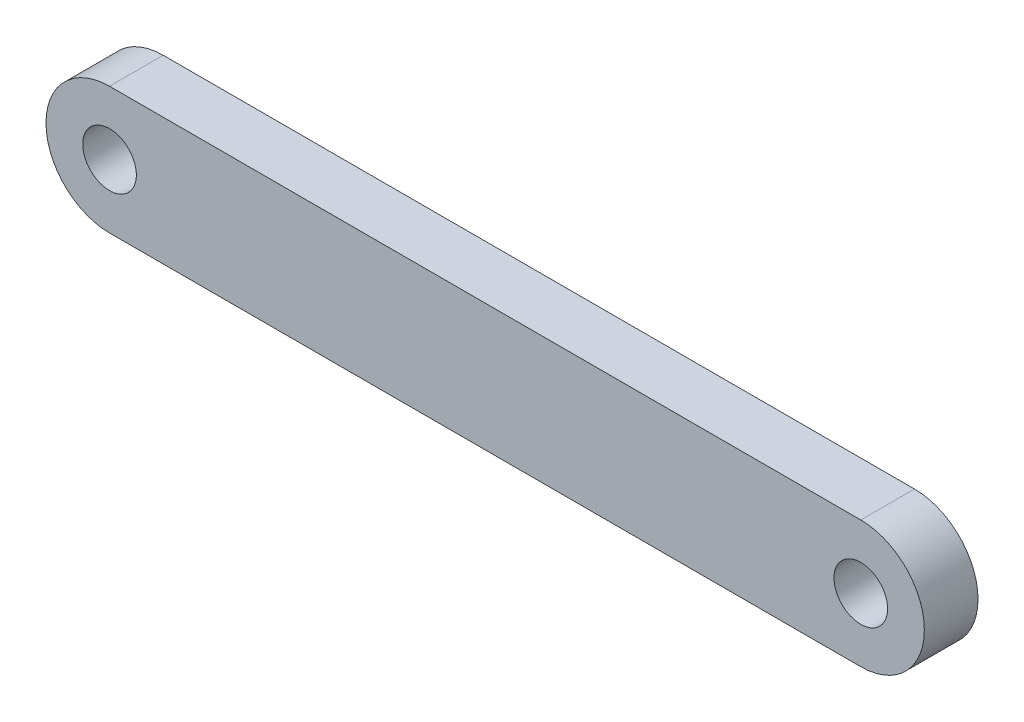
ISO-10303-21;
HEADER;
FILE_DESCRIPTION(('STEP AP214'),'2;1');
FILE_NAME('part.step','',(''),(''),'','','');
FILE_SCHEMA(('AUTOMOTIVE_DESIGN { 1 0 10303 214 1 1 1 1 }'));
ENDSEC;
DATA;
#1=APPLICATION_CONTEXT('core data for automotive mechanical design processes');
#2=APPLICATION_PROTOCOL_DEFINITION('international standard','automotive_design',2000,#1);
#3=PRODUCT_CONTEXT('',#1,'mechanical');
#4=PRODUCT('Part','Part','',(#3));
#5=PRODUCT_RELATED_PRODUCT_CATEGORY('part','',(#4));
#6=PRODUCT_DEFINITION_FORMATION('','',#4);
#7=PRODUCT_DEFINITION_CONTEXT('part definition',#1,'design');
#8=PRODUCT_DEFINITION('design','',#6,#7);
#9=PRODUCT_DEFINITION_SHAPE('','',#8);
#10=(LENGTH_UNIT() NAMED_UNIT(*) SI_UNIT(.MILLI.,.METRE.));
#11=(NAMED_UNIT(*) PLANE_ANGLE_UNIT() SI_UNIT($,.RADIAN.));
#12=(NAMED_UNIT(*) SI_UNIT($,.STERADIAN.) SOLID_ANGLE_UNIT());
#13=UNCERTAINTY_MEASURE_WITH_UNIT(LENGTH_MEASURE(1.E-05),#10,'distance_accuracy_value','');
#14=(GEOMETRIC_REPRESENTATION_CONTEXT(3) GLOBAL_UNCERTAINTY_ASSIGNED_CONTEXT((#13)) GLOBAL_UNIT_ASSIGNED_CONTEXT((#10,
#11,#12)) REPRESENTATION_CONTEXT('',''));
#15=CARTESIAN_POINT('',(0.,0.,0.));
#16=DIRECTION('',(0.,0.,1.));
#17=DIRECTION('',(1.,0.,0.));
#18=AXIS2_PLACEMENT_3D('',#15,#16,#17);
#19=CARTESIAN_POINT('',(-13.8947368421053,0.,2.));
#20=DIRECTION('',(0.,0.,1.));
#21=DIRECTION('',(1.,0.,0.));
#22=AXIS2_PLACEMENT_3D('',#19,#20,#21);
#23=PLANE('',#22);
#24=CARTESIAN_POINT('',(14.1052631578947,0.,2.));
#25=DIRECTION('',(0.,0.,1.));
#26=DIRECTION('',(1.,0.,0.));
#27=AXIS2_PLACEMENT_3D('',#24,#25,#26);
#28=CIRCLE('',#27,1.);
#29=CARTESIAN_POINT('',(15.1052631578947,0.,2.));
#30=VERTEX_POINT('',#29);
#31=EDGE_CURVE('E100',#30,#30,#28,.T.);
#32=ORIENTED_EDGE('',*,*,#31,.F.);
#33=EDGE_LOOP('',(#32));
#34=FACE_BOUND('',#33,.T.);
#35=CARTESIAN_POINT('',(-13.8947368421053,0.,2.));
#36=DIRECTION('',(0.,0.,1.));
#37=DIRECTION('',(1.,0.,0.));
#38=AXIS2_PLACEMENT_3D('',#35,#36,#37);
#39=CIRCLE('',#38,2.36842105263158);
#40=CARTESIAN_POINT('',(-13.8947368421053,2.36842105263158,2.));
#41=VERTEX_POINT('',#40);
#42=CARTESIAN_POINT('',(-13.8947368421053,-2.36842105263158,2.));
#43=VERTEX_POINT('',#42);
#44=EDGE_CURVE('E85',#41,#43,#39,.T.);
#45=ORIENTED_EDGE('',*,*,#44,.T.);
#46=DIRECTION('',(1.,0.,0.));
#47=VECTOR('',#46,1.);
#48=CARTESIAN_POINT('',(-13.8947368421053,-2.36842105263158,2.));
#49=LINE('',#48,#47);
#50=CARTESIAN_POINT('',(14.1052631578947,-2.36842105263158,2.));
#51=VERTEX_POINT('',#50);
#52=EDGE_CURVE('E80',#43,#51,#49,.T.);
#53=ORIENTED_EDGE('',*,*,#52,.T.);
#54=CARTESIAN_POINT('',(14.1052631578947,0.,2.));
#55=DIRECTION('',(0.,0.,1.));
#56=DIRECTION('',(1.,0.,0.));
#57=AXIS2_PLACEMENT_3D('',#54,#55,#56);
#58=CIRCLE('',#57,2.36842105263158);
#59=CARTESIAN_POINT('',(14.1052631578947,2.36842105263158,2.));
#60=VERTEX_POINT('',#59);
#61=EDGE_CURVE('E83',#51,#60,#58,.T.);
#62=ORIENTED_EDGE('',*,*,#61,.T.);
#63=DIRECTION('',(-1.,0.,0.));
#64=VECTOR('',#63,1.);
#65=CARTESIAN_POINT('',(-13.8947368421053,2.36842105263158,2.));
#66=LINE('',#65,#64);
#67=EDGE_CURVE('E50',#60,#41,#66,.T.);
#68=ORIENTED_EDGE('',*,*,#67,.T.);
#69=EDGE_LOOP('',(#45,#53,#62,#68));
#70=FACE_BOUND('',#69,.T.);
#71=CARTESIAN_POINT('',(-13.8947368421053,0.,2.));
#72=DIRECTION('',(0.,0.,1.));
#73=DIRECTION('',(1.,0.,0.));
#74=AXIS2_PLACEMENT_3D('',#71,#72,#73);
#75=CIRCLE('',#74,1.);
#76=CARTESIAN_POINT('',(-12.8947368421053,0.,2.));
#77=VERTEX_POINT('',#76);
#78=EDGE_CURVE('E115',#77,#77,#75,.T.);
#79=ORIENTED_EDGE('',*,*,#78,.F.);
#80=EDGE_LOOP('',(#79));
#81=FACE_BOUND('',#80,.T.);
#82=ADVANCED_FACE('F33',(#34,#70,#81),#23,.T.);
#83=CARTESIAN_POINT('',(-13.8947368421053,0.,0.));
#84=DIRECTION('',(0.,0.,1.));
#85=DIRECTION('',(1.,0.,0.));
#86=AXIS2_PLACEMENT_3D('',#83,#84,#85);
#87=PLANE('',#86);
#88=CARTESIAN_POINT('',(-13.8947368421053,0.,0.));
#89=DIRECTION('',(0.,0.,1.));
#90=DIRECTION('',(1.,0.,0.));
#91=AXIS2_PLACEMENT_3D('',#88,#89,#90);
#92=CIRCLE('',#91,2.36842105263158);
#93=CARTESIAN_POINT('',(-13.8947368421053,2.36842105263158,0.));
#94=VERTEX_POINT('',#93);
#95=CARTESIAN_POINT('',(-13.8947368421053,-2.36842105263158,0.));
#96=VERTEX_POINT('',#95);
#97=EDGE_CURVE('E97',#94,#96,#92,.T.);
#98=ORIENTED_EDGE('',*,*,#97,.F.);
#99=DIRECTION('',(-1.,0.,0.));
#100=VECTOR('',#99,1.);
#101=CARTESIAN_POINT('',(-13.8947368421053,2.36842105263158,0.));
#102=LINE('',#101,#100);
#103=CARTESIAN_POINT('',(14.1052631578947,2.36842105263158,0.));
#104=VERTEX_POINT('',#103);
#105=EDGE_CURVE('E73',#104,#94,#102,.T.);
#106=ORIENTED_EDGE('',*,*,#105,.F.);
#107=CARTESIAN_POINT('',(14.1052631578947,0.,0.));
#108=DIRECTION('',(0.,0.,1.));
#109=DIRECTION('',(1.,0.,0.));
#110=AXIS2_PLACEMENT_3D('',#107,#108,#109);
#111=CIRCLE('',#110,2.36842105263158);
#112=CARTESIAN_POINT('',(14.1052631578947,-2.36842105263158,0.));
#113=VERTEX_POINT('',#112);
#114=EDGE_CURVE('E67',#113,#104,#111,.T.);
#115=ORIENTED_EDGE('',*,*,#114,.F.);
#116=DIRECTION('',(1.,0.,0.));
#117=VECTOR('',#116,1.);
#118=CARTESIAN_POINT('',(-13.8947368421053,-2.36842105263158,0.));
#119=LINE('',#118,#117);
#120=EDGE_CURVE('E89',#96,#113,#119,.T.);
#121=ORIENTED_EDGE('',*,*,#120,.F.);
#122=EDGE_LOOP('',(#98,#106,#115,#121));
#123=FACE_BOUND('',#122,.T.);
#124=CARTESIAN_POINT('',(14.1052631578947,0.,0.));
#125=DIRECTION('',(0.,0.,1.));
#126=DIRECTION('',(1.,0.,0.));
#127=AXIS2_PLACEMENT_3D('',#124,#125,#126);
#128=CIRCLE('',#127,1.);
#129=CARTESIAN_POINT('',(15.1052631578947,0.,0.));
#130=VERTEX_POINT('',#129);
#131=EDGE_CURVE('E112',#130,#130,#128,.T.);
#132=ORIENTED_EDGE('',*,*,#131,.T.);
#133=EDGE_LOOP('',(#132));
#134=FACE_BOUND('',#133,.T.);
#135=CARTESIAN_POINT('',(-13.8947368421053,0.,0.));
#136=DIRECTION('',(0.,0.,1.));
#137=DIRECTION('',(1.,0.,0.));
#138=AXIS2_PLACEMENT_3D('',#135,#136,#137);
#139=CIRCLE('',#138,1.);
#140=CARTESIAN_POINT('',(-12.8947368421053,0.,0.));
#141=VERTEX_POINT('',#140);
#142=EDGE_CURVE('E118',#141,#141,#139,.T.);
#143=ORIENTED_EDGE('',*,*,#142,.T.);
#144=EDGE_LOOP('',(#143));
#145=FACE_BOUND('',#144,.T.);
#146=ADVANCED_FACE('F108',(#123,#134,#145),#87,.F.);
#147=CARTESIAN_POINT('',(-13.8947368421053,0.,2.));
#148=DIRECTION('',(0.,0.,-1.));
#149=DIRECTION('',(-1.,0.,0.));
#150=AXIS2_PLACEMENT_3D('',#147,#148,#149);
#151=CYLINDRICAL_SURFACE('',#150,2.36842105263158);
#152=ORIENTED_EDGE('',*,*,#97,.T.);
#153=DIRECTION('',(0.,0.,-1.));
#154=VECTOR('',#153,1.);
#155=CARTESIAN_POINT('',(-13.8947368421053,-2.36842105263158,2.));
#156=LINE('',#155,#154);
#157=EDGE_CURVE('E11',#43,#96,#156,.T.);
#158=ORIENTED_EDGE('',*,*,#157,.F.);
#159=ORIENTED_EDGE('',*,*,#44,.F.);
#160=DIRECTION('',(0.,0.,-1.));
#161=VECTOR('',#160,1.);
#162=CARTESIAN_POINT('',(-13.8947368421053,2.36842105263158,2.));
#163=LINE('',#162,#161);
#164=EDGE_CURVE('E93',#41,#94,#163,.T.);
#165=ORIENTED_EDGE('',*,*,#164,.T.);
#166=EDGE_LOOP('',(#152,#158,#159,#165));
#167=FACE_BOUND('',#166,.T.);
#168=ADVANCED_FACE('F35',(#167),#151,.T.);
#169=CARTESIAN_POINT('',(-13.8947368421053,-2.36842105263158,2.));
#170=DIRECTION('',(0.,1.,0.));
#171=DIRECTION('',(0.,0.,1.));
#172=AXIS2_PLACEMENT_3D('',#169,#170,#171);
#173=PLANE('',#172);
#174=ORIENTED_EDGE('',*,*,#120,.T.);
#175=DIRECTION('',(0.,0.,-1.));
#176=VECTOR('',#175,1.);
#177=CARTESIAN_POINT('',(14.1052631578947,-2.36842105263158,2.));
#178=LINE('',#177,#176);
#179=EDGE_CURVE('E42',#51,#113,#178,.T.);
#180=ORIENTED_EDGE('',*,*,#179,.F.);
#181=ORIENTED_EDGE('',*,*,#52,.F.);
#182=ORIENTED_EDGE('',*,*,#157,.T.);
#183=EDGE_LOOP('',(#174,#180,#181,#182));
#184=FACE_BOUND('',#183,.T.);
#185=ADVANCED_FACE('F88',(#184),#173,.F.);
#186=CARTESIAN_POINT('',(14.1052631578947,0.,2.));
#187=DIRECTION('',(0.,0.,-1.));
#188=DIRECTION('',(-1.,0.,0.));
#189=AXIS2_PLACEMENT_3D('',#186,#187,#188);
#190=CYLINDRICAL_SURFACE('',#189,2.36842105263158);
#191=ORIENTED_EDGE('',*,*,#114,.T.);
#192=DIRECTION('',(0.,0.,-1.));
#193=VECTOR('',#192,1.);
#194=CARTESIAN_POINT('',(14.1052631578947,2.36842105263158,2.));
#195=LINE('',#194,#193);
#196=EDGE_CURVE('E90',#60,#104,#195,.T.);
#197=ORIENTED_EDGE('',*,*,#196,.F.);
#198=ORIENTED_EDGE('',*,*,#61,.F.);
#199=ORIENTED_EDGE('',*,*,#179,.T.);
#200=EDGE_LOOP('',(#191,#197,#198,#199));
#201=FACE_BOUND('',#200,.T.);
#202=ADVANCED_FACE('F91',(#201),#190,.T.);
#203=CARTESIAN_POINT('',(-13.8947368421053,2.36842105263158,2.));
#204=DIRECTION('',(0.,-1.,0.));
#205=DIRECTION('',(0.,0.,-1.));
#206=AXIS2_PLACEMENT_3D('',#203,#204,#205);
#207=PLANE('',#206);
#208=ORIENTED_EDGE('',*,*,#105,.T.);
#209=ORIENTED_EDGE('',*,*,#164,.F.);
#210=ORIENTED_EDGE('',*,*,#67,.F.);
#211=ORIENTED_EDGE('',*,*,#196,.T.);
#212=EDGE_LOOP('',(#208,#209,#210,#211));
#213=FACE_BOUND('',#212,.T.);
#214=ADVANCED_FACE('F105',(#213),#207,.F.);
#215=CARTESIAN_POINT('',(14.1052631578947,0.,2.));
#216=DIRECTION('',(0.,0.,-1.));
#217=DIRECTION('',(-1.,0.,0.));
#218=AXIS2_PLACEMENT_3D('',#215,#216,#217);
#219=CYLINDRICAL_SURFACE('',#218,1.);
#220=ORIENTED_EDGE('',*,*,#31,.T.);
#221=EDGE_LOOP('',(#220));
#222=FACE_BOUND('',#221,.T.);
#223=ORIENTED_EDGE('',*,*,#131,.F.);
#224=EDGE_LOOP('',(#223));
#225=FACE_BOUND('',#224,.T.);
#226=ADVANCED_FACE('F135',(#222,#225),#219,.F.);
#227=CARTESIAN_POINT('',(-13.8947368421053,0.,2.));
#228=DIRECTION('',(0.,0.,-1.));
#229=DIRECTION('',(-1.,0.,0.));
#230=AXIS2_PLACEMENT_3D('',#227,#228,#229);
#231=CYLINDRICAL_SURFACE('',#230,1.);
#232=ORIENTED_EDGE('',*,*,#78,.T.);
#233=EDGE_LOOP('',(#232));
#234=FACE_BOUND('',#233,.T.);
#235=ORIENTED_EDGE('',*,*,#142,.F.);
#236=EDGE_LOOP('',(#235));
#237=FACE_BOUND('',#236,.T.);
#238=ADVANCED_FACE('F124',(#234,#237),#231,.F.);
#239=CLOSED_SHELL('',(#82,#146,#168,#185,#202,#214,#226,#238));
#240=MANIFOLD_SOLID_BREP('B2',#239);
#241=ADVANCED_BREP_SHAPE_REPRESENTATION('',(#18,#240),#14);
#242=SHAPE_DEFINITION_REPRESENTATION(#9,#241);
ENDSEC;
END-ISO-10303-21;
